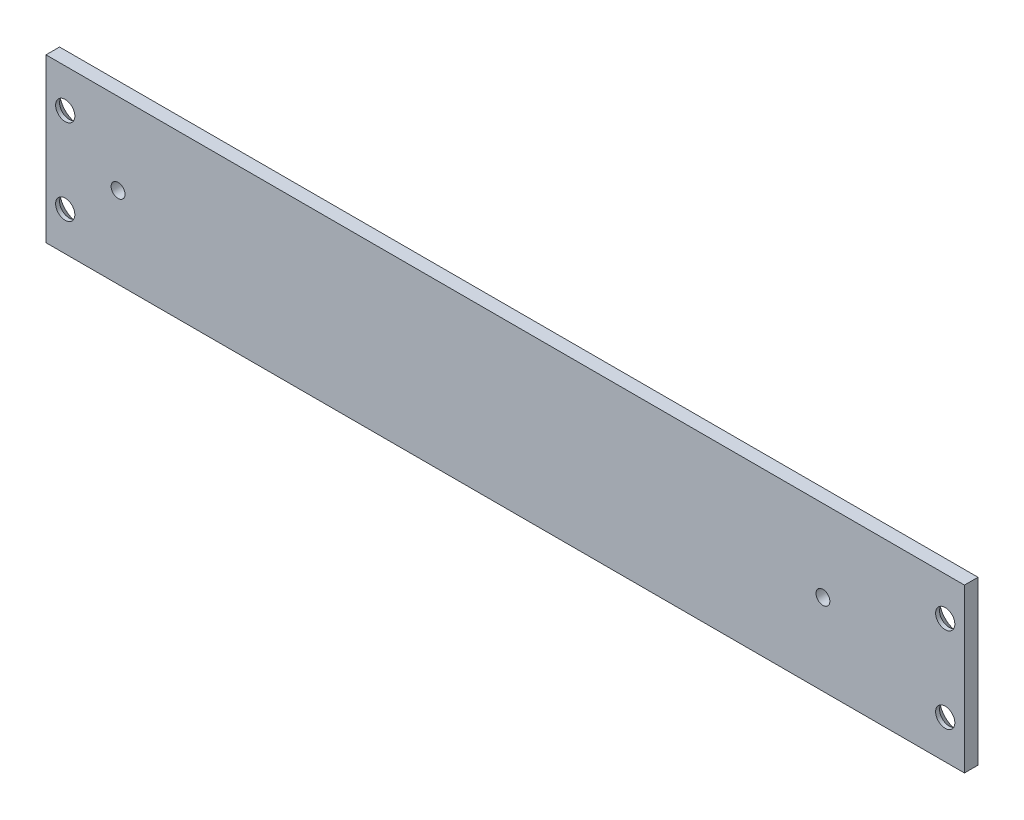
ISO-10303-21;
HEADER;
FILE_DESCRIPTION(('STEP AP214'),'2;1');
FILE_NAME('part.step','',(''),(''),'','','');
FILE_SCHEMA(('AUTOMOTIVE_DESIGN { 1 0 10303 214 1 1 1 1 }'));
ENDSEC;
DATA;
#1=APPLICATION_CONTEXT('core data for automotive mechanical design processes');
#2=APPLICATION_PROTOCOL_DEFINITION('international standard','automotive_design',2000,#1);
#3=PRODUCT_CONTEXT('',#1,'mechanical');
#4=PRODUCT('Part','Part','',(#3));
#5=PRODUCT_RELATED_PRODUCT_CATEGORY('part','',(#4));
#6=PRODUCT_DEFINITION_FORMATION('','',#4);
#7=PRODUCT_DEFINITION_CONTEXT('part definition',#1,'design');
#8=PRODUCT_DEFINITION('design','',#6,#7);
#9=PRODUCT_DEFINITION_SHAPE('','',#8);
#10=(LENGTH_UNIT() NAMED_UNIT(*) SI_UNIT(.MILLI.,.METRE.));
#11=(NAMED_UNIT(*) PLANE_ANGLE_UNIT() SI_UNIT($,.RADIAN.));
#12=(NAMED_UNIT(*) SI_UNIT($,.STERADIAN.) SOLID_ANGLE_UNIT());
#13=UNCERTAINTY_MEASURE_WITH_UNIT(LENGTH_MEASURE(1.E-05),#10,'distance_accuracy_value','');
#14=(GEOMETRIC_REPRESENTATION_CONTEXT(3) GLOBAL_UNCERTAINTY_ASSIGNED_CONTEXT((#13)) GLOBAL_UNIT_ASSIGNED_CONTEXT((#10,
#11,#12)) REPRESENTATION_CONTEXT('',''));
#15=CARTESIAN_POINT('',(0.,0.,0.));
#16=DIRECTION('',(0.,0.,1.));
#17=DIRECTION('',(1.,0.,0.));
#18=AXIS2_PLACEMENT_3D('',#15,#16,#17);
#19=CARTESIAN_POINT('',(0.,0.,6.35));
#20=DIRECTION('',(0.,0.,-1.));
#21=DIRECTION('',(-1.,0.,0.));
#22=AXIS2_PLACEMENT_3D('',#19,#20,#21);
#23=PLANE('',#22);
#24=CARTESIAN_POINT('',(33.75,38.1,6.35));
#25=DIRECTION('',(0.,0.,1.));
#26=DIRECTION('',(1.,0.,0.));
#27=AXIS2_PLACEMENT_3D('',#24,#25,#26);
#28=CIRCLE('',#27,3.25);
#29=CARTESIAN_POINT('',(37.,38.1,6.35));
#30=VERTEX_POINT('',#29);
#31=EDGE_CURVE('E223',#30,#30,#28,.T.);
#32=ORIENTED_EDGE('',*,*,#31,.F.);
#33=EDGE_LOOP('',(#32));
#34=FACE_BOUND('',#33,.T.);
#35=CARTESIAN_POINT('',(421.,18.1,6.35));
#36=DIRECTION('',(0.,0.,1.));
#37=DIRECTION('',(1.,0.,0.));
#38=AXIS2_PLACEMENT_3D('',#35,#36,#37);
#39=CIRCLE('',#38,4.49999999999996);
#40=CARTESIAN_POINT('',(425.5,18.1,6.35));
#41=VERTEX_POINT('',#40);
#42=EDGE_CURVE('E217',#41,#41,#39,.T.);
#43=ORIENTED_EDGE('',*,*,#42,.F.);
#44=EDGE_LOOP('',(#43));
#45=FACE_BOUND('',#44,.T.);
#46=CARTESIAN_POINT('',(9.00000000000001,58.1,6.35));
#47=DIRECTION('',(0.,0.,1.));
#48=DIRECTION('',(1.,0.,0.));
#49=AXIS2_PLACEMENT_3D('',#46,#47,#48);
#50=CIRCLE('',#49,4.5);
#51=CARTESIAN_POINT('',(13.5,58.1,6.35));
#52=VERTEX_POINT('',#51);
#53=EDGE_CURVE('E189',#52,#52,#50,.T.);
#54=ORIENTED_EDGE('',*,*,#53,.F.);
#55=EDGE_LOOP('',(#54));
#56=FACE_BOUND('',#55,.T.);
#57=DIRECTION('',(0.,-1.,0.));
#58=VECTOR('',#57,1.);
#59=CARTESIAN_POINT('',(0.,0.,6.35));
#60=LINE('',#59,#58);
#61=CARTESIAN_POINT('',(0.,76.2,6.35));
#62=VERTEX_POINT('',#61);
#63=CARTESIAN_POINT('',(0.,0.,6.35));
#64=VERTEX_POINT('',#63);
#65=EDGE_CURVE('E93',#62,#64,#60,.T.);
#66=ORIENTED_EDGE('',*,*,#65,.T.);
#67=DIRECTION('',(1.,0.,0.));
#68=VECTOR('',#67,1.);
#69=CARTESIAN_POINT('',(0.,0.,6.35));
#70=LINE('',#69,#68);
#71=CARTESIAN_POINT('',(430.,0.,6.35));
#72=VERTEX_POINT('',#71);
#73=EDGE_CURVE('E83',#64,#72,#70,.T.);
#74=ORIENTED_EDGE('',*,*,#73,.T.);
#75=DIRECTION('',(0.,1.,0.));
#76=VECTOR('',#75,1.);
#77=CARTESIAN_POINT('',(430.,0.,6.35));
#78=LINE('',#77,#76);
#79=CARTESIAN_POINT('',(430.,76.2,6.35));
#80=VERTEX_POINT('',#79);
#81=EDGE_CURVE('E92',#72,#80,#78,.T.);
#82=ORIENTED_EDGE('',*,*,#81,.T.);
#83=DIRECTION('',(-1.,0.,0.));
#84=VECTOR('',#83,1.);
#85=CARTESIAN_POINT('',(0.,76.2,6.35));
#86=LINE('',#85,#84);
#87=EDGE_CURVE('E98',#80,#62,#86,.T.);
#88=ORIENTED_EDGE('',*,*,#87,.T.);
#89=EDGE_LOOP('',(#66,#74,#82,#88));
#90=FACE_BOUND('',#89,.T.);
#91=CARTESIAN_POINT('',(9.00000000000001,18.1,6.35));
#92=DIRECTION('',(0.,0.,1.));
#93=DIRECTION('',(-1.,0.,0.));
#94=AXIS2_PLACEMENT_3D('',#91,#92,#93);
#95=CIRCLE('',#94,4.5);
#96=CARTESIAN_POINT('',(4.50000000000001,18.1,6.35));
#97=VERTEX_POINT('',#96);
#98=EDGE_CURVE('E214',#97,#97,#95,.T.);
#99=ORIENTED_EDGE('',*,*,#98,.F.);
#100=EDGE_LOOP('',(#99));
#101=FACE_BOUND('',#100,.T.);
#102=CARTESIAN_POINT('',(421.,58.1,6.35));
#103=DIRECTION('',(0.,0.,1.));
#104=DIRECTION('',(-1.,0.,0.));
#105=AXIS2_PLACEMENT_3D('',#102,#103,#104);
#106=CIRCLE('',#105,4.49999999999996);
#107=CARTESIAN_POINT('',(416.5,58.1,6.35));
#108=VERTEX_POINT('',#107);
#109=EDGE_CURVE('E220',#108,#108,#106,.T.);
#110=ORIENTED_EDGE('',*,*,#109,.F.);
#111=EDGE_LOOP('',(#110));
#112=FACE_BOUND('',#111,.T.);
#113=CARTESIAN_POINT('',(363.75,38.1,6.35));
#114=DIRECTION('',(0.,0.,1.));
#115=DIRECTION('',(1.,0.,0.));
#116=AXIS2_PLACEMENT_3D('',#113,#114,#115);
#117=CIRCLE('',#116,3.25000000000001);
#118=CARTESIAN_POINT('',(367.,38.1,6.35));
#119=VERTEX_POINT('',#118);
#120=EDGE_CURVE('E227',#119,#119,#117,.T.);
#121=ORIENTED_EDGE('',*,*,#120,.F.);
#122=EDGE_LOOP('',(#121));
#123=FACE_BOUND('',#122,.T.);
#124=ADVANCED_FACE('F32',(#34,#45,#56,#90,#101,#112,#123),#23,.F.);
#125=CARTESIAN_POINT('',(0.,0.,0.));
#126=DIRECTION('',(0.,0.,-1.));
#127=DIRECTION('',(-1.,0.,0.));
#128=AXIS2_PLACEMENT_3D('',#125,#126,#127);
#129=PLANE('',#128);
#130=CARTESIAN_POINT('',(33.75,38.1,0.));
#131=DIRECTION('',(0.,0.,1.));
#132=DIRECTION('',(1.,0.,0.));
#133=AXIS2_PLACEMENT_3D('',#130,#131,#132);
#134=CIRCLE('',#133,3.25);
#135=CARTESIAN_POINT('',(37.,38.1,0.));
#136=VERTEX_POINT('',#135);
#137=EDGE_CURVE('E224',#136,#136,#134,.T.);
#138=ORIENTED_EDGE('',*,*,#137,.T.);
#139=EDGE_LOOP('',(#138));
#140=FACE_BOUND('',#139,.T.);
#141=DIRECTION('',(0.,-1.,0.));
#142=VECTOR('',#141,1.);
#143=CARTESIAN_POINT('',(0.,0.,0.));
#144=LINE('',#143,#142);
#145=CARTESIAN_POINT('',(0.,18.1,0.));
#146=VERTEX_POINT('',#145);
#147=CARTESIAN_POINT('',(0.,0.,0.));
#148=VERTEX_POINT('',#147);
#149=EDGE_CURVE('E108',#146,#148,#144,.T.);
#150=ORIENTED_EDGE('',*,*,#149,.F.);
#151=CARTESIAN_POINT('',(9.00000000000001,18.1,0.));
#152=DIRECTION('',(0.,0.,-1.));
#153=DIRECTION('',(-1.,0.,0.));
#154=AXIS2_PLACEMENT_3D('',#151,#152,#153);
#155=CIRCLE('',#154,8.9999999999999);
#156=EDGE_CURVE('E120',#146,#146,#155,.F.);
#157=ORIENTED_EDGE('',*,*,#156,.T.);
#158=CARTESIAN_POINT('',(0.,58.1,0.));
#159=VERTEX_POINT('',#158);
#160=EDGE_CURVE('E186',#159,#146,#144,.T.);
#161=ORIENTED_EDGE('',*,*,#160,.F.);
#162=CARTESIAN_POINT('',(9.00000000000001,58.1,0.));
#163=DIRECTION('',(0.,0.,-1.));
#164=DIRECTION('',(-1.,0.,0.));
#165=AXIS2_PLACEMENT_3D('',#162,#163,#164);
#166=CIRCLE('',#165,8.9999999999999);
#167=EDGE_CURVE('E117',#159,#159,#166,.F.);
#168=ORIENTED_EDGE('',*,*,#167,.T.);
#169=CARTESIAN_POINT('',(0.,76.2,0.));
#170=VERTEX_POINT('',#169);
#171=EDGE_CURVE('E191',#170,#159,#144,.T.);
#172=ORIENTED_EDGE('',*,*,#171,.F.);
#173=DIRECTION('',(-1.,0.,0.));
#174=VECTOR('',#173,1.);
#175=CARTESIAN_POINT('',(0.,76.2,0.));
#176=LINE('',#175,#174);
#177=CARTESIAN_POINT('',(430.,76.2,0.));
#178=VERTEX_POINT('',#177);
#179=EDGE_CURVE('E102',#178,#170,#176,.T.);
#180=ORIENTED_EDGE('',*,*,#179,.F.);
#181=DIRECTION('',(0.,1.,0.));
#182=VECTOR('',#181,1.);
#183=CARTESIAN_POINT('',(430.,0.,0.));
#184=LINE('',#183,#182);
#185=CARTESIAN_POINT('',(430.,58.1,0.));
#186=VERTEX_POINT('',#185);
#187=EDGE_CURVE('E197',#186,#178,#184,.T.);
#188=ORIENTED_EDGE('',*,*,#187,.F.);
#189=CARTESIAN_POINT('',(421.,58.1,0.));
#190=DIRECTION('',(0.,0.,-1.));
#191=DIRECTION('',(-1.,0.,0.));
#192=AXIS2_PLACEMENT_3D('',#189,#190,#191);
#193=CIRCLE('',#192,8.99999999999995);
#194=EDGE_CURVE('E45',#186,#186,#193,.F.);
#195=ORIENTED_EDGE('',*,*,#194,.T.);
#196=CARTESIAN_POINT('',(430.,18.1,0.));
#197=VERTEX_POINT('',#196);
#198=EDGE_CURVE('E201',#197,#186,#184,.T.);
#199=ORIENTED_EDGE('',*,*,#198,.F.);
#200=CARTESIAN_POINT('',(421.,18.1,0.));
#201=DIRECTION('',(0.,0.,-1.));
#202=DIRECTION('',(-1.,0.,0.));
#203=AXIS2_PLACEMENT_3D('',#200,#201,#202);
#204=CIRCLE('',#203,8.9999999999999);
#205=EDGE_CURVE('E50',#197,#197,#204,.F.);
#206=ORIENTED_EDGE('',*,*,#205,.T.);
#207=CARTESIAN_POINT('',(430.,0.,0.));
#208=VERTEX_POINT('',#207);
#209=EDGE_CURVE('E198',#208,#197,#184,.T.);
#210=ORIENTED_EDGE('',*,*,#209,.F.);
#211=DIRECTION('',(1.,0.,0.));
#212=VECTOR('',#211,1.);
#213=CARTESIAN_POINT('',(0.,0.,0.));
#214=LINE('',#213,#212);
#215=EDGE_CURVE('E188',#148,#208,#214,.T.);
#216=ORIENTED_EDGE('',*,*,#215,.F.);
#217=EDGE_LOOP('',(#150,#157,#161,#168,#172,#180,#188,#195,#199,#206,#210,#216));
#218=FACE_BOUND('',#217,.T.);
#219=CARTESIAN_POINT('',(363.75,38.1,0.));
#220=DIRECTION('',(0.,0.,1.));
#221=DIRECTION('',(1.,0.,0.));
#222=AXIS2_PLACEMENT_3D('',#219,#220,#221);
#223=CIRCLE('',#222,3.25000000000001);
#224=CARTESIAN_POINT('',(367.,38.1,0.));
#225=VERTEX_POINT('',#224);
#226=EDGE_CURVE('E230',#225,#225,#223,.T.);
#227=ORIENTED_EDGE('',*,*,#226,.T.);
#228=EDGE_LOOP('',(#227));
#229=FACE_BOUND('',#228,.T.);
#230=ADVANCED_FACE('F146',(#140,#218,#229),#129,.T.);
#231=CARTESIAN_POINT('',(0.,0.,6.35));
#232=DIRECTION('',(1.,0.,0.));
#233=DIRECTION('',(0.,1.,0.));
#234=AXIS2_PLACEMENT_3D('',#231,#232,#233);
#235=PLANE('',#234);
#236=ORIENTED_EDGE('',*,*,#171,.T.);
#237=ORIENTED_EDGE('',*,*,#160,.T.);
#238=ORIENTED_EDGE('',*,*,#149,.T.);
#239=DIRECTION('',(0.,0.,-1.));
#240=VECTOR('',#239,1.);
#241=CARTESIAN_POINT('',(0.,0.,6.35));
#242=LINE('',#241,#240);
#243=EDGE_CURVE('E87',#64,#148,#242,.T.);
#244=ORIENTED_EDGE('',*,*,#243,.F.);
#245=ORIENTED_EDGE('',*,*,#65,.F.);
#246=DIRECTION('',(0.,0.,-1.));
#247=VECTOR('',#246,1.);
#248=CARTESIAN_POINT('',(0.,76.2,6.35));
#249=LINE('',#248,#247);
#250=EDGE_CURVE('E203',#62,#170,#249,.T.);
#251=ORIENTED_EDGE('',*,*,#250,.T.);
#252=EDGE_LOOP('',(#236,#237,#238,#244,#245,#251));
#253=FACE_BOUND('',#252,.T.);
#254=ADVANCED_FACE('F105',(#253),#235,.F.);
#255=CARTESIAN_POINT('',(0.,0.,6.35));
#256=DIRECTION('',(0.,1.,0.));
#257=DIRECTION('',(-1.,0.,0.));
#258=AXIS2_PLACEMENT_3D('',#255,#256,#257);
#259=PLANE('',#258);
#260=ORIENTED_EDGE('',*,*,#215,.T.);
#261=DIRECTION('',(0.,0.,-1.));
#262=VECTOR('',#261,1.);
#263=CARTESIAN_POINT('',(430.,0.,6.35));
#264=LINE('',#263,#262);
#265=EDGE_CURVE('E89',#72,#208,#264,.T.);
#266=ORIENTED_EDGE('',*,*,#265,.F.);
#267=ORIENTED_EDGE('',*,*,#73,.F.);
#268=ORIENTED_EDGE('',*,*,#243,.T.);
#269=EDGE_LOOP('',(#260,#266,#267,#268));
#270=FACE_BOUND('',#269,.T.);
#271=ADVANCED_FACE('F85',(#270),#259,.F.);
#272=CARTESIAN_POINT('',(430.,0.,6.35));
#273=DIRECTION('',(-1.,0.,0.));
#274=DIRECTION('',(0.,0.,1.));
#275=AXIS2_PLACEMENT_3D('',#272,#273,#274);
#276=PLANE('',#275);
#277=ORIENTED_EDGE('',*,*,#209,.T.);
#278=ORIENTED_EDGE('',*,*,#198,.T.);
#279=ORIENTED_EDGE('',*,*,#187,.T.);
#280=DIRECTION('',(0.,0.,-1.));
#281=VECTOR('',#280,1.);
#282=CARTESIAN_POINT('',(430.,76.2,6.35));
#283=LINE('',#282,#281);
#284=EDGE_CURVE('E112',#80,#178,#283,.T.);
#285=ORIENTED_EDGE('',*,*,#284,.F.);
#286=ORIENTED_EDGE('',*,*,#81,.F.);
#287=ORIENTED_EDGE('',*,*,#265,.T.);
#288=EDGE_LOOP('',(#277,#278,#279,#285,#286,#287));
#289=FACE_BOUND('',#288,.T.);
#290=ADVANCED_FACE('F163',(#289),#276,.F.);
#291=CARTESIAN_POINT('',(0.,76.2,6.35));
#292=DIRECTION('',(0.,-1.,0.));
#293=DIRECTION('',(0.,0.,-1.));
#294=AXIS2_PLACEMENT_3D('',#291,#292,#293);
#295=PLANE('',#294);
#296=ORIENTED_EDGE('',*,*,#179,.T.);
#297=ORIENTED_EDGE('',*,*,#250,.F.);
#298=ORIENTED_EDGE('',*,*,#87,.F.);
#299=ORIENTED_EDGE('',*,*,#284,.T.);
#300=EDGE_LOOP('',(#296,#297,#298,#299));
#301=FACE_BOUND('',#300,.T.);
#302=ADVANCED_FACE('F160',(#301),#295,.F.);
#303=CARTESIAN_POINT('',(9.00000000000001,58.1,6.35));
#304=DIRECTION('',(0.,0.,-1.));
#305=DIRECTION('',(-1.,0.,0.));
#306=AXIS2_PLACEMENT_3D('',#303,#304,#305);
#307=CYLINDRICAL_SURFACE('',#306,4.5);
#308=CARTESIAN_POINT('',(9.00000000000001,58.1,4.49999999999994));
#309=DIRECTION('',(0.,0.,-1.));
#310=DIRECTION('',(-1.,0.,0.));
#311=AXIS2_PLACEMENT_3D('',#308,#309,#310);
#312=CIRCLE('',#311,4.5);
#313=CARTESIAN_POINT('',(4.50000000000001,58.1,4.49999999999994));
#314=VERTEX_POINT('',#313);
#315=EDGE_CURVE('E126',#314,#314,#312,.T.);
#316=ORIENTED_EDGE('',*,*,#315,.T.);
#317=EDGE_LOOP('',(#316));
#318=FACE_BOUND('',#317,.T.);
#319=ORIENTED_EDGE('',*,*,#53,.T.);
#320=EDGE_LOOP('',(#319));
#321=FACE_BOUND('',#320,.T.);
#322=ADVANCED_FACE('F157',(#318,#321),#307,.F.);
#323=CARTESIAN_POINT('',(9.00000000000001,18.1,6.35));
#324=DIRECTION('',(0.,0.,-1.));
#325=DIRECTION('',(-1.,0.,0.));
#326=AXIS2_PLACEMENT_3D('',#323,#324,#325);
#327=CYLINDRICAL_SURFACE('',#326,4.5);
#328=CARTESIAN_POINT('',(9.00000000000001,18.1,4.49999999999994));
#329=DIRECTION('',(0.,0.,-1.));
#330=DIRECTION('',(-1.,0.,0.));
#331=AXIS2_PLACEMENT_3D('',#328,#329,#330);
#332=CIRCLE('',#331,4.5);
#333=CARTESIAN_POINT('',(4.50000000000001,18.1,4.49999999999994));
#334=VERTEX_POINT('',#333);
#335=EDGE_CURVE('E123',#334,#334,#332,.T.);
#336=ORIENTED_EDGE('',*,*,#335,.T.);
#337=EDGE_LOOP('',(#336));
#338=FACE_BOUND('',#337,.T.);
#339=ORIENTED_EDGE('',*,*,#98,.T.);
#340=EDGE_LOOP('',(#339));
#341=FACE_BOUND('',#340,.T.);
#342=ADVANCED_FACE('F251',(#338,#341),#327,.F.);
#343=CARTESIAN_POINT('',(421.,18.1,6.35));
#344=DIRECTION('',(0.,0.,-1.));
#345=DIRECTION('',(-1.,0.,0.));
#346=AXIS2_PLACEMENT_3D('',#343,#344,#345);
#347=CYLINDRICAL_SURFACE('',#346,4.49999999999996);
#348=CARTESIAN_POINT('',(421.,18.1,4.49999999999995));
#349=DIRECTION('',(0.,0.,-1.));
#350=DIRECTION('',(-1.,0.,0.));
#351=AXIS2_PLACEMENT_3D('',#348,#349,#350);
#352=CIRCLE('',#351,4.49999999999996);
#353=CARTESIAN_POINT('',(416.5,18.1,4.49999999999995));
#354=VERTEX_POINT('',#353);
#355=EDGE_CURVE('E40',#354,#354,#352,.T.);
#356=ORIENTED_EDGE('',*,*,#355,.T.);
#357=EDGE_LOOP('',(#356));
#358=FACE_BOUND('',#357,.T.);
#359=ORIENTED_EDGE('',*,*,#42,.T.);
#360=EDGE_LOOP('',(#359));
#361=FACE_BOUND('',#360,.T.);
#362=ADVANCED_FACE('F131',(#358,#361),#347,.F.);
#363=CARTESIAN_POINT('',(421.,58.1,6.35));
#364=DIRECTION('',(0.,0.,-1.));
#365=DIRECTION('',(-1.,0.,0.));
#366=AXIS2_PLACEMENT_3D('',#363,#364,#365);
#367=CYLINDRICAL_SURFACE('',#366,4.49999999999996);
#368=CARTESIAN_POINT('',(421.,58.1,4.5));
#369=DIRECTION('',(0.,0.,-1.));
#370=DIRECTION('',(-1.,0.,0.));
#371=AXIS2_PLACEMENT_3D('',#368,#369,#370);
#372=CIRCLE('',#371,4.49999999999996);
#373=CARTESIAN_POINT('',(416.5,58.1,4.5));
#374=VERTEX_POINT('',#373);
#375=EDGE_CURVE('E11',#374,#374,#372,.T.);
#376=ORIENTED_EDGE('',*,*,#375,.T.);
#377=EDGE_LOOP('',(#376));
#378=FACE_BOUND('',#377,.T.);
#379=ORIENTED_EDGE('',*,*,#109,.T.);
#380=EDGE_LOOP('',(#379));
#381=FACE_BOUND('',#380,.T.);
#382=ADVANCED_FACE('F241',(#378,#381),#367,.F.);
#383=CARTESIAN_POINT('',(33.75,38.1,6.35));
#384=DIRECTION('',(0.,0.,-1.));
#385=DIRECTION('',(-1.,0.,0.));
#386=AXIS2_PLACEMENT_3D('',#383,#384,#385);
#387=CYLINDRICAL_SURFACE('',#386,3.25);
#388=ORIENTED_EDGE('',*,*,#31,.T.);
#389=EDGE_LOOP('',(#388));
#390=FACE_BOUND('',#389,.T.);
#391=ORIENTED_EDGE('',*,*,#137,.F.);
#392=EDGE_LOOP('',(#391));
#393=FACE_BOUND('',#392,.T.);
#394=ADVANCED_FACE('F178',(#390,#393),#387,.F.);
#395=CARTESIAN_POINT('',(363.75,38.1,6.35));
#396=DIRECTION('',(0.,0.,-1.));
#397=DIRECTION('',(-1.,0.,0.));
#398=AXIS2_PLACEMENT_3D('',#395,#396,#397);
#399=CYLINDRICAL_SURFACE('',#398,3.25000000000001);
#400=ORIENTED_EDGE('',*,*,#120,.T.);
#401=EDGE_LOOP('',(#400));
#402=FACE_BOUND('',#401,.T.);
#403=ORIENTED_EDGE('',*,*,#226,.F.);
#404=EDGE_LOOP('',(#403));
#405=FACE_BOUND('',#404,.T.);
#406=ADVANCED_FACE('F173',(#402,#405),#399,.F.);
#407=CARTESIAN_POINT('',(9.00000000000001,18.1,0.));
#408=DIRECTION('',(0.,0.,-1.));
#409=DIRECTION('',(-1.,0.,0.));
#410=AXIS2_PLACEMENT_3D('',#407,#408,#409);
#411=CONICAL_SURFACE('',#410,8.9999999999999,0.785398163397444);
#412=ORIENTED_EDGE('',*,*,#335,.F.);
#413=EDGE_LOOP('',(#412));
#414=FACE_BOUND('',#413,.T.);
#415=ORIENTED_EDGE('',*,*,#156,.F.);
#416=EDGE_LOOP('',(#415));
#417=FACE_BOUND('',#416,.T.);
#418=ADVANCED_FACE('F142',(#414,#417),#411,.F.);
#419=CARTESIAN_POINT('',(9.00000000000001,58.1,0.));
#420=DIRECTION('',(0.,0.,-1.));
#421=DIRECTION('',(-1.,0.,0.));
#422=AXIS2_PLACEMENT_3D('',#419,#420,#421);
#423=CONICAL_SURFACE('',#422,8.9999999999999,0.785398163397444);
#424=ORIENTED_EDGE('',*,*,#315,.F.);
#425=EDGE_LOOP('',(#424));
#426=FACE_BOUND('',#425,.T.);
#427=ORIENTED_EDGE('',*,*,#167,.F.);
#428=EDGE_LOOP('',(#427));
#429=FACE_BOUND('',#428,.T.);
#430=ADVANCED_FACE('F136',(#426,#429),#423,.F.);
#431=CARTESIAN_POINT('',(421.,18.1,0.));
#432=DIRECTION('',(0.,0.,-1.));
#433=DIRECTION('',(-1.,0.,0.));
#434=AXIS2_PLACEMENT_3D('',#431,#432,#433);
#435=CONICAL_SURFACE('',#434,8.9999999999999,0.785398163397447);
#436=ORIENTED_EDGE('',*,*,#355,.F.);
#437=EDGE_LOOP('',(#436));
#438=FACE_BOUND('',#437,.T.);
#439=ORIENTED_EDGE('',*,*,#205,.F.);
#440=EDGE_LOOP('',(#439));
#441=FACE_BOUND('',#440,.T.);
#442=ADVANCED_FACE('F134',(#438,#441),#435,.F.);
#443=CARTESIAN_POINT('',(421.,58.1,0.));
#444=DIRECTION('',(0.,0.,-1.));
#445=DIRECTION('',(-1.,0.,0.));
#446=AXIS2_PLACEMENT_3D('',#443,#444,#445);
#447=CONICAL_SURFACE('',#446,8.99999999999995,0.785398163397447);
#448=ORIENTED_EDGE('',*,*,#375,.F.);
#449=EDGE_LOOP('',(#448));
#450=FACE_BOUND('',#449,.T.);
#451=ORIENTED_EDGE('',*,*,#194,.F.);
#452=EDGE_LOOP('',(#451));
#453=FACE_BOUND('',#452,.T.);
#454=ADVANCED_FACE('F34',(#450,#453),#447,.F.);
#455=CLOSED_SHELL('',(#124,#230,#254,#271,#290,#302,#322,#342,#362,#382,#394,#406,#418,#430,
#442,#454));
#456=MANIFOLD_SOLID_BREP('B2',#455);
#457=ADVANCED_BREP_SHAPE_REPRESENTATION('',(#18,#456),#14);
#458=SHAPE_DEFINITION_REPRESENTATION(#9,#457);
ENDSEC;
END-ISO-10303-21;
